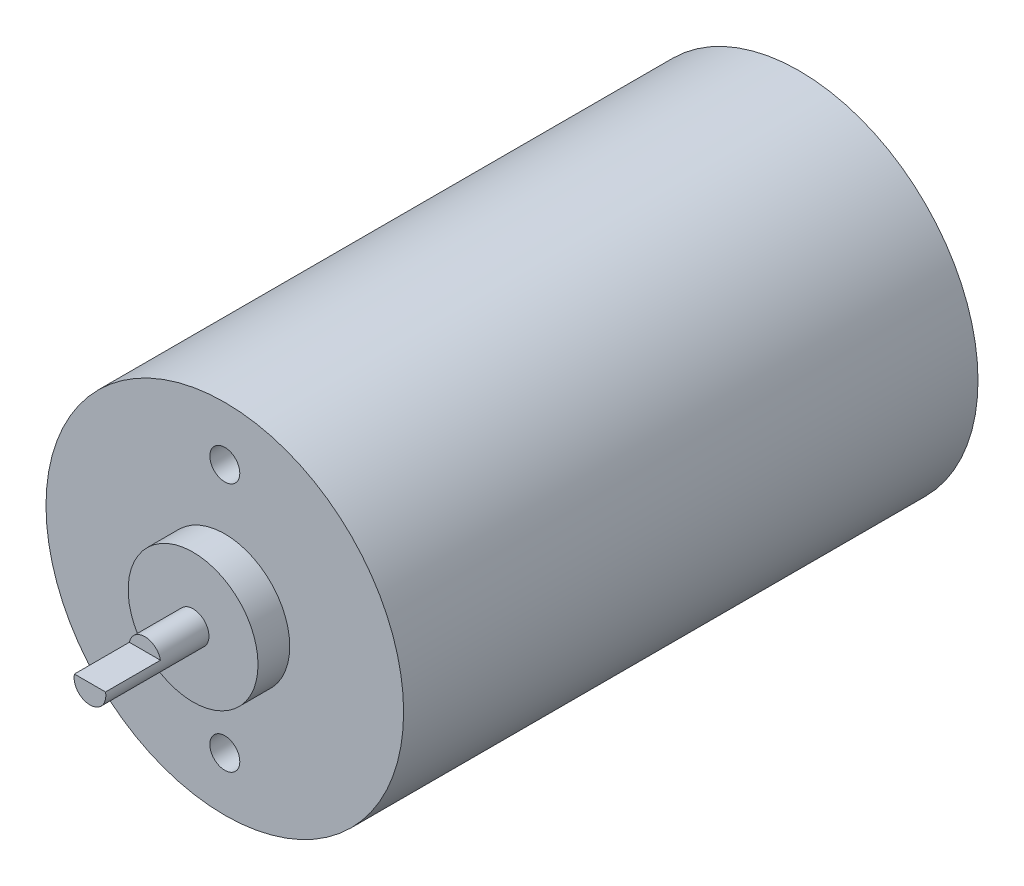
ISO-10303-21;
HEADER;
FILE_DESCRIPTION(('STEP AP214'),'2;1');
FILE_NAME('part.step','',(''),(''),'','','');
FILE_SCHEMA(('AUTOMOTIVE_DESIGN { 1 0 10303 214 1 1 1 1 }'));
ENDSEC;
DATA;
#1=APPLICATION_CONTEXT('core data for automotive mechanical design processes');
#2=APPLICATION_PROTOCOL_DEFINITION('international standard','automotive_design',2000,#1);
#3=PRODUCT_CONTEXT('',#1,'mechanical');
#4=PRODUCT('Part','Part','',(#3));
#5=PRODUCT_RELATED_PRODUCT_CATEGORY('part','',(#4));
#6=PRODUCT_DEFINITION_FORMATION('','',#4);
#7=PRODUCT_DEFINITION_CONTEXT('part definition',#1,'design');
#8=PRODUCT_DEFINITION('design','',#6,#7);
#9=PRODUCT_DEFINITION_SHAPE('','',#8);
#10=(LENGTH_UNIT() NAMED_UNIT(*) SI_UNIT(.MILLI.,.METRE.));
#11=(NAMED_UNIT(*) PLANE_ANGLE_UNIT() SI_UNIT($,.RADIAN.));
#12=(NAMED_UNIT(*) SI_UNIT($,.STERADIAN.) SOLID_ANGLE_UNIT());
#13=UNCERTAINTY_MEASURE_WITH_UNIT(LENGTH_MEASURE(1.E-05),#10,'distance_accuracy_value','');
#14=(GEOMETRIC_REPRESENTATION_CONTEXT(3) GLOBAL_UNCERTAINTY_ASSIGNED_CONTEXT((#13)) GLOBAL_UNIT_ASSIGNED_CONTEXT((#10,
#11,#12)) REPRESENTATION_CONTEXT('',''));
#15=CARTESIAN_POINT('',(0.,0.,0.));
#16=DIRECTION('',(0.,0.,1.));
#17=DIRECTION('',(1.,0.,0.));
#18=AXIS2_PLACEMENT_3D('',#15,#16,#17);
#19=CARTESIAN_POINT('',(0.,0.,57.5));
#20=DIRECTION('',(0.,0.,-1.));
#21=DIRECTION('',(-1.,0.,0.));
#22=AXIS2_PLACEMENT_3D('',#19,#20,#21);
#23=CYLINDRICAL_SURFACE('',#22,17.9);
#24=CARTESIAN_POINT('',(0.,0.,57.5));
#25=DIRECTION('',(0.,0.,1.));
#26=DIRECTION('',(1.,0.,0.));
#27=AXIS2_PLACEMENT_3D('',#24,#25,#26);
#28=CIRCLE('',#27,17.9);
#29=CARTESIAN_POINT('',(17.9,0.,57.5));
#30=VERTEX_POINT('',#29);
#31=EDGE_CURVE('E84',#30,#30,#28,.T.);
#32=ORIENTED_EDGE('',*,*,#31,.F.);
#33=EDGE_LOOP('',(#32));
#34=FACE_BOUND('',#33,.T.);
#35=CARTESIAN_POINT('',(0.,0.,0.));
#36=DIRECTION('',(0.,0.,1.));
#37=DIRECTION('',(1.,0.,0.));
#38=AXIS2_PLACEMENT_3D('',#35,#36,#37);
#39=CIRCLE('',#38,17.9);
#40=CARTESIAN_POINT('',(17.9,0.,0.));
#41=VERTEX_POINT('',#40);
#42=EDGE_CURVE('E75',#41,#41,#39,.T.);
#43=ORIENTED_EDGE('',*,*,#42,.T.);
#44=EDGE_LOOP('',(#43));
#45=FACE_BOUND('',#44,.T.);
#46=ADVANCED_FACE('F33',(#34,#45),#23,.T.);
#47=CARTESIAN_POINT('',(0.,0.,57.5));
#48=DIRECTION('',(0.,0.,1.));
#49=DIRECTION('',(1.,0.,0.));
#50=AXIS2_PLACEMENT_3D('',#47,#48,#49);
#51=PLANE('',#50);
#52=CARTESIAN_POINT('',(0.,12.5,57.5));
#53=DIRECTION('',(0.,0.,1.));
#54=DIRECTION('',(1.,0.,0.));
#55=AXIS2_PLACEMENT_3D('',#52,#53,#54);
#56=CIRCLE('',#55,1.5);
#57=CARTESIAN_POINT('',(1.5,12.5,57.5));
#58=VERTEX_POINT('',#57);
#59=EDGE_CURVE('E225',#58,#58,#56,.T.);
#60=ORIENTED_EDGE('',*,*,#59,.F.);
#61=EDGE_LOOP('',(#60));
#62=FACE_BOUND('',#61,.T.);
#63=CARTESIAN_POINT('',(0.,-12.5,57.5));
#64=DIRECTION('',(0.,0.,1.));
#65=DIRECTION('',(1.,0.,0.));
#66=AXIS2_PLACEMENT_3D('',#63,#64,#65);
#67=CIRCLE('',#66,1.5);
#68=CARTESIAN_POINT('',(1.5,-12.5,57.5));
#69=VERTEX_POINT('',#68);
#70=EDGE_CURVE('E219',#69,#69,#67,.T.);
#71=ORIENTED_EDGE('',*,*,#70,.F.);
#72=EDGE_LOOP('',(#71));
#73=FACE_BOUND('',#72,.T.);
#74=CARTESIAN_POINT('',(0.,0.,57.5));
#75=DIRECTION('',(0.,0.,1.));
#76=DIRECTION('',(1.,0.,0.));
#77=AXIS2_PLACEMENT_3D('',#74,#75,#76);
#78=CIRCLE('',#77,6.5);
#79=CARTESIAN_POINT('',(6.5,0.,57.5));
#80=VERTEX_POINT('',#79);
#81=EDGE_CURVE('E80',#80,#80,#78,.T.);
#82=ORIENTED_EDGE('',*,*,#81,.F.);
#83=EDGE_LOOP('',(#82));
#84=FACE_BOUND('',#83,.T.);
#85=ORIENTED_EDGE('',*,*,#31,.T.);
#86=EDGE_LOOP('',(#85));
#87=FACE_BOUND('',#86,.T.);
#88=ADVANCED_FACE('F93',(#62,#73,#84,#87),#51,.T.);
#89=CARTESIAN_POINT('',(0.,0.,0.));
#90=DIRECTION('',(0.,0.,1.));
#91=DIRECTION('',(1.,0.,0.));
#92=AXIS2_PLACEMENT_3D('',#89,#90,#91);
#93=PLANE('',#92);
#94=ORIENTED_EDGE('',*,*,#42,.F.);
#95=EDGE_LOOP('',(#94));
#96=FACE_BOUND('',#95,.T.);
#97=ADVANCED_FACE('F90',(#96),#93,.F.);
#98=CARTESIAN_POINT('',(0.,0.,60.675));
#99=DIRECTION('',(0.,0.,-1.));
#100=DIRECTION('',(-1.,0.,0.));
#101=AXIS2_PLACEMENT_3D('',#98,#99,#100);
#102=CYLINDRICAL_SURFACE('',#101,6.5);
#103=CARTESIAN_POINT('',(0.,0.,60.675));
#104=DIRECTION('',(0.,0.,1.));
#105=DIRECTION('',(1.,0.,0.));
#106=AXIS2_PLACEMENT_3D('',#103,#104,#105);
#107=CIRCLE('',#106,6.5);
#108=CARTESIAN_POINT('',(6.5,0.,60.675));
#109=VERTEX_POINT('',#108);
#110=EDGE_CURVE('E72',#109,#109,#107,.T.);
#111=ORIENTED_EDGE('',*,*,#110,.F.);
#112=EDGE_LOOP('',(#111));
#113=FACE_BOUND('',#112,.T.);
#114=ORIENTED_EDGE('',*,*,#81,.T.);
#115=EDGE_LOOP('',(#114));
#116=FACE_BOUND('',#115,.T.);
#117=ADVANCED_FACE('F92',(#113,#116),#102,.T.);
#118=CARTESIAN_POINT('',(0.,0.,60.675));
#119=DIRECTION('',(0.,0.,1.));
#120=DIRECTION('',(1.,0.,0.));
#121=AXIS2_PLACEMENT_3D('',#118,#119,#120);
#122=PLANE('',#121);
#123=CARTESIAN_POINT('',(0.,0.,60.675));
#124=DIRECTION('',(0.,0.,1.));
#125=DIRECTION('',(1.,0.,0.));
#126=AXIS2_PLACEMENT_3D('',#123,#124,#125);
#127=CIRCLE('',#126,1.5875);
#128=CARTESIAN_POINT('',(1.5875,0.,60.675));
#129=VERTEX_POINT('',#128);
#130=EDGE_CURVE('E40',#129,#129,#127,.T.);
#131=ORIENTED_EDGE('',*,*,#130,.F.);
#132=EDGE_LOOP('',(#131));
#133=FACE_BOUND('',#132,.T.);
#134=ORIENTED_EDGE('',*,*,#110,.T.);
#135=EDGE_LOOP('',(#134));
#136=FACE_BOUND('',#135,.T.);
#137=ADVANCED_FACE('F98',(#133,#136),#122,.T.);
#138=CARTESIAN_POINT('',(0.,0.,71.));
#139=DIRECTION('',(0.,0.,-1.));
#140=DIRECTION('',(-1.,0.,0.));
#141=AXIS2_PLACEMENT_3D('',#138,#139,#140);
#142=CYLINDRICAL_SURFACE('',#141,1.5875);
#143=CARTESIAN_POINT('',(0.,0.,71.));
#144=DIRECTION('',(0.,0.,1.));
#145=DIRECTION('',(1.,0.,0.));
#146=AXIS2_PLACEMENT_3D('',#143,#144,#145);
#147=CIRCLE('',#146,1.5875);
#148=CARTESIAN_POINT('',(-1.55506412300987,0.319267635891182,71.));
#149=VERTEX_POINT('',#148);
#150=CARTESIAN_POINT('',(1.55506412300987,0.319267635891182,71.));
#151=VERTEX_POINT('',#150);
#152=EDGE_CURVE('E69',#149,#151,#147,.T.);
#153=ORIENTED_EDGE('',*,*,#152,.F.);
#154=DIRECTION('',(0.,0.,1.));
#155=VECTOR('',#154,1.);
#156=CARTESIAN_POINT('',(-1.55506412300987,0.319267635891182,65.5));
#157=LINE('',#156,#155);
#158=CARTESIAN_POINT('',(-1.55506412300987,0.319267635891182,65.5));
#159=VERTEX_POINT('',#158);
#160=EDGE_CURVE('E47',#159,#149,#157,.T.);
#161=ORIENTED_EDGE('',*,*,#160,.F.);
#162=CARTESIAN_POINT('',(0.,0.,65.5));
#163=DIRECTION('',(0.,0.,-1.));
#164=DIRECTION('',(-1.,0.,0.));
#165=AXIS2_PLACEMENT_3D('',#162,#163,#164);
#166=CIRCLE('',#165,1.5875);
#167=CARTESIAN_POINT('',(1.55506412300987,0.319267635891182,65.5));
#168=VERTEX_POINT('',#167);
#169=EDGE_CURVE('E11',#159,#168,#166,.T.);
#170=ORIENTED_EDGE('',*,*,#169,.T.);
#171=DIRECTION('',(0.,0.,1.));
#172=VECTOR('',#171,1.);
#173=CARTESIAN_POINT('',(1.55506412300987,0.319267635891182,65.5));
#174=LINE('',#173,#172);
#175=EDGE_CURVE('E53',#168,#151,#174,.T.);
#176=ORIENTED_EDGE('',*,*,#175,.T.);
#177=EDGE_LOOP('',(#153,#161,#170,#176));
#178=FACE_BOUND('',#177,.T.);
#179=ORIENTED_EDGE('',*,*,#130,.T.);
#180=EDGE_LOOP('',(#179));
#181=FACE_BOUND('',#180,.T.);
#182=ADVANCED_FACE('F67',(#178,#181),#142,.T.);
#183=CARTESIAN_POINT('',(0.,0.,71.));
#184=DIRECTION('',(0.,0.,1.));
#185=DIRECTION('',(1.,0.,0.));
#186=AXIS2_PLACEMENT_3D('',#183,#184,#185);
#187=PLANE('',#186);
#188=DIRECTION('',(1.,0.,0.));
#189=VECTOR('',#188,1.);
#190=CARTESIAN_POINT('',(-1.55506412300987,0.319267635891182,71.));
#191=LINE('',#190,#189);
#192=EDGE_CURVE('E58',#149,#151,#191,.T.);
#193=ORIENTED_EDGE('',*,*,#192,.F.);
#194=ORIENTED_EDGE('',*,*,#152,.T.);
#195=EDGE_LOOP('',(#193,#194));
#196=FACE_BOUND('',#195,.T.);
#197=ADVANCED_FACE('F71',(#196),#187,.T.);
#198=CARTESIAN_POINT('',(0.,0.0192676358911816,65.5));
#199=DIRECTION('',(0.,0.,-1.));
#200=DIRECTION('',(-1.,0.,0.));
#201=AXIS2_PLACEMENT_3D('',#198,#199,#200);
#202=PLANE('',#201);
#203=DIRECTION('',(1.,0.,0.));
#204=VECTOR('',#203,1.);
#205=CARTESIAN_POINT('',(-1.55506412300987,0.319267635891182,65.5));
#206=LINE('',#205,#204);
#207=EDGE_CURVE('E63',#159,#168,#206,.T.);
#208=ORIENTED_EDGE('',*,*,#207,.T.);
#209=ORIENTED_EDGE('',*,*,#169,.F.);
#210=EDGE_LOOP('',(#208,#209));
#211=FACE_BOUND('',#210,.T.);
#212=ADVANCED_FACE('F165',(#211),#202,.F.);
#213=CARTESIAN_POINT('',(-1.55506412300987,0.319267635891182,65.5));
#214=DIRECTION('',(0.,-1.,0.));
#215=DIRECTION('',(0.,0.,-1.));
#216=AXIS2_PLACEMENT_3D('',#213,#214,#215);
#217=PLANE('',#216);
#218=ORIENTED_EDGE('',*,*,#192,.T.);
#219=ORIENTED_EDGE('',*,*,#175,.F.);
#220=ORIENTED_EDGE('',*,*,#207,.F.);
#221=ORIENTED_EDGE('',*,*,#160,.T.);
#222=EDGE_LOOP('',(#218,#219,#220,#221));
#223=FACE_BOUND('',#222,.T.);
#224=ADVANCED_FACE('F59',(#223),#217,.F.);
#225=CARTESIAN_POINT('',(0.,-12.5,52.));
#226=DIRECTION('',(0.,0.,1.));
#227=DIRECTION('',(1.,0.,0.));
#228=AXIS2_PLACEMENT_3D('',#225,#226,#227);
#229=CYLINDRICAL_SURFACE('',#228,1.5);
#230=CARTESIAN_POINT('',(0.,-12.5,52.));
#231=DIRECTION('',(0.,0.,1.));
#232=DIRECTION('',(1.,0.,0.));
#233=AXIS2_PLACEMENT_3D('',#230,#231,#232);
#234=CIRCLE('',#233,1.5);
#235=CARTESIAN_POINT('',(1.5,-12.5,52.));
#236=VERTEX_POINT('',#235);
#237=EDGE_CURVE('E222',#236,#236,#234,.T.);
#238=ORIENTED_EDGE('',*,*,#237,.F.);
#239=EDGE_LOOP('',(#238));
#240=FACE_BOUND('',#239,.T.);
#241=ORIENTED_EDGE('',*,*,#70,.T.);
#242=EDGE_LOOP('',(#241));
#243=FACE_BOUND('',#242,.T.);
#244=ADVANCED_FACE('F124',(#240,#243),#229,.F.);
#245=CARTESIAN_POINT('',(0.,-12.5,52.));
#246=DIRECTION('',(0.,0.,1.));
#247=DIRECTION('',(1.,0.,0.));
#248=AXIS2_PLACEMENT_3D('',#245,#246,#247);
#249=PLANE('',#248);
#250=ORIENTED_EDGE('',*,*,#237,.T.);
#251=EDGE_LOOP('',(#250));
#252=FACE_BOUND('',#251,.T.);
#253=ADVANCED_FACE('F129',(#252),#249,.T.);
#254=CARTESIAN_POINT('',(0.,12.5,52.));
#255=DIRECTION('',(0.,0.,1.));
#256=DIRECTION('',(1.,0.,0.));
#257=AXIS2_PLACEMENT_3D('',#254,#255,#256);
#258=CYLINDRICAL_SURFACE('',#257,1.5);
#259=CARTESIAN_POINT('',(0.,12.5,52.));
#260=DIRECTION('',(0.,0.,1.));
#261=DIRECTION('',(1.,0.,0.));
#262=AXIS2_PLACEMENT_3D('',#259,#260,#261);
#263=CIRCLE('',#262,1.5);
#264=CARTESIAN_POINT('',(1.5,12.5,52.));
#265=VERTEX_POINT('',#264);
#266=EDGE_CURVE('E64',#265,#265,#263,.T.);
#267=ORIENTED_EDGE('',*,*,#266,.F.);
#268=EDGE_LOOP('',(#267));
#269=FACE_BOUND('',#268,.T.);
#270=ORIENTED_EDGE('',*,*,#59,.T.);
#271=EDGE_LOOP('',(#270));
#272=FACE_BOUND('',#271,.T.);
#273=ADVANCED_FACE('F139',(#269,#272),#258,.F.);
#274=CARTESIAN_POINT('',(0.,12.5,52.));
#275=DIRECTION('',(0.,0.,1.));
#276=DIRECTION('',(1.,0.,0.));
#277=AXIS2_PLACEMENT_3D('',#274,#275,#276);
#278=PLANE('',#277);
#279=ORIENTED_EDGE('',*,*,#266,.T.);
#280=EDGE_LOOP('',(#279));
#281=FACE_BOUND('',#280,.T.);
#282=ADVANCED_FACE('F149',(#281),#278,.T.);
#283=CLOSED_SHELL('',(#46,#88,#97,#117,#137,#182,#197,#212,#224,#244,#253,#273,#282));
#284=MANIFOLD_SOLID_BREP('B2',#283);
#285=ADVANCED_BREP_SHAPE_REPRESENTATION('',(#18,#284),#14);
#286=SHAPE_DEFINITION_REPRESENTATION(#9,#285);
ENDSEC;
END-ISO-10303-21;
